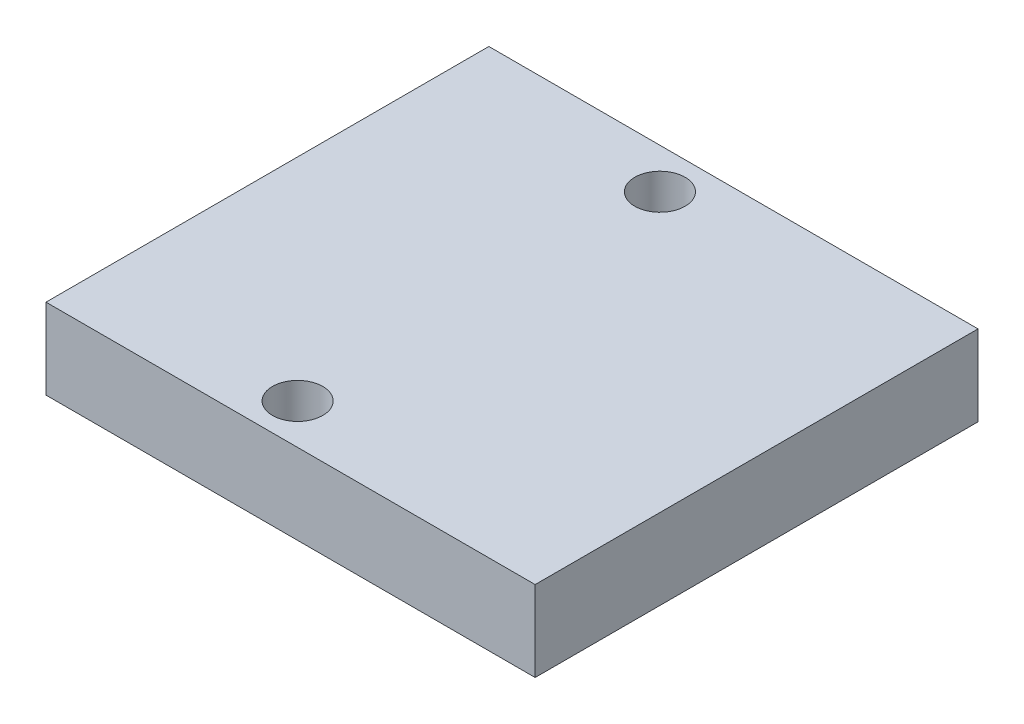
ISO-10303-21;
HEADER;
FILE_DESCRIPTION(('STEP AP214'),'2;1');
FILE_NAME('part.step','',(''),(''),'','','');
FILE_SCHEMA(('AUTOMOTIVE_DESIGN { 1 0 10303 214 1 1 1 1 }'));
ENDSEC;
DATA;
#1=APPLICATION_CONTEXT('core data for automotive mechanical design processes');
#2=APPLICATION_PROTOCOL_DEFINITION('international standard','automotive_design',2000,#1);
#3=PRODUCT_CONTEXT('',#1,'mechanical');
#4=PRODUCT('Part','Part','',(#3));
#5=PRODUCT_RELATED_PRODUCT_CATEGORY('part','',(#4));
#6=PRODUCT_DEFINITION_FORMATION('','',#4);
#7=PRODUCT_DEFINITION_CONTEXT('part definition',#1,'design');
#8=PRODUCT_DEFINITION('design','',#6,#7);
#9=PRODUCT_DEFINITION_SHAPE('','',#8);
#10=(LENGTH_UNIT() NAMED_UNIT(*) SI_UNIT(.MILLI.,.METRE.));
#11=(NAMED_UNIT(*) PLANE_ANGLE_UNIT() SI_UNIT($,.RADIAN.));
#12=(NAMED_UNIT(*) SI_UNIT($,.STERADIAN.) SOLID_ANGLE_UNIT());
#13=UNCERTAINTY_MEASURE_WITH_UNIT(LENGTH_MEASURE(1.E-05),#10,'distance_accuracy_value','');
#14=(GEOMETRIC_REPRESENTATION_CONTEXT(3) GLOBAL_UNCERTAINTY_ASSIGNED_CONTEXT((#13)) GLOBAL_UNIT_ASSIGNED_CONTEXT((#10,
#11,#12)) REPRESENTATION_CONTEXT('',''));
#15=CARTESIAN_POINT('',(0.,0.,0.));
#16=DIRECTION('',(0.,0.,1.));
#17=DIRECTION('',(1.,0.,0.));
#18=AXIS2_PLACEMENT_3D('',#15,#16,#17);
#19=CARTESIAN_POINT('',(0.,4.,0.));
#20=DIRECTION('',(0.,1.,0.));
#21=DIRECTION('',(0.,0.,1.));
#22=AXIS2_PLACEMENT_3D('',#19,#20,#21);
#23=PLANE('',#22);
#24=CARTESIAN_POINT('',(-1.64999999999998,4.,-9.));
#25=DIRECTION('',(0.,1.,0.));
#26=DIRECTION('',(0.,0.,1.));
#27=AXIS2_PLACEMENT_3D('',#24,#25,#26);
#28=CIRCLE('',#27,1.25);
#29=CARTESIAN_POINT('',(-1.64999999999998,4.,-7.75));
#30=VERTEX_POINT('',#29);
#31=EDGE_CURVE('E102',#30,#30,#28,.T.);
#32=ORIENTED_EDGE('',*,*,#31,.F.);
#33=EDGE_LOOP('',(#32));
#34=FACE_BOUND('',#33,.T.);
#35=DIRECTION('',(0.,0.,-1.));
#36=VECTOR('',#35,1.);
#37=CARTESIAN_POINT('',(12.15,4.,-11.));
#38=LINE('',#37,#36);
#39=CARTESIAN_POINT('',(12.15,4.,11.));
#40=VERTEX_POINT('',#39);
#41=CARTESIAN_POINT('',(12.15,4.,-11.));
#42=VERTEX_POINT('',#41);
#43=EDGE_CURVE('E87',#40,#42,#38,.T.);
#44=ORIENTED_EDGE('',*,*,#43,.T.);
#45=DIRECTION('',(-1.,0.,0.));
#46=VECTOR('',#45,1.);
#47=CARTESIAN_POINT('',(-12.15,4.,-11.));
#48=LINE('',#47,#46);
#49=CARTESIAN_POINT('',(-12.15,4.,-11.));
#50=VERTEX_POINT('',#49);
#51=EDGE_CURVE('E82',#42,#50,#48,.T.);
#52=ORIENTED_EDGE('',*,*,#51,.T.);
#53=DIRECTION('',(0.,0.,1.));
#54=VECTOR('',#53,1.);
#55=CARTESIAN_POINT('',(-12.15,4.,-11.));
#56=LINE('',#55,#54);
#57=CARTESIAN_POINT('',(-12.15,4.,11.));
#58=VERTEX_POINT('',#57);
#59=EDGE_CURVE('E85',#50,#58,#56,.T.);
#60=ORIENTED_EDGE('',*,*,#59,.T.);
#61=DIRECTION('',(1.,0.,0.));
#62=VECTOR('',#61,1.);
#63=CARTESIAN_POINT('',(-12.15,4.,11.));
#64=LINE('',#63,#62);
#65=EDGE_CURVE('E52',#58,#40,#64,.T.);
#66=ORIENTED_EDGE('',*,*,#65,.T.);
#67=EDGE_LOOP('',(#44,#52,#60,#66));
#68=FACE_BOUND('',#67,.T.);
#69=CARTESIAN_POINT('',(-1.64999999999998,4.,9.));
#70=DIRECTION('',(0.,1.,0.));
#71=DIRECTION('',(0.,0.,-1.));
#72=AXIS2_PLACEMENT_3D('',#69,#70,#71);
#73=CIRCLE('',#72,1.25);
#74=CARTESIAN_POINT('',(-1.64999999999998,4.,7.75));
#75=VERTEX_POINT('',#74);
#76=EDGE_CURVE('E117',#75,#75,#73,.T.);
#77=ORIENTED_EDGE('',*,*,#76,.F.);
#78=EDGE_LOOP('',(#77));
#79=FACE_BOUND('',#78,.T.);
#80=ADVANCED_FACE('F35',(#34,#68,#79),#23,.T.);
#81=CARTESIAN_POINT('',(0.,0.,0.));
#82=DIRECTION('',(0.,1.,0.));
#83=DIRECTION('',(0.,0.,1.));
#84=AXIS2_PLACEMENT_3D('',#81,#82,#83);
#85=PLANE('',#84);
#86=CARTESIAN_POINT('',(-1.64999999999998,0.,-9.));
#87=DIRECTION('',(0.,1.,0.));
#88=DIRECTION('',(0.,0.,1.));
#89=AXIS2_PLACEMENT_3D('',#86,#87,#88);
#90=CIRCLE('',#89,1.25);
#91=CARTESIAN_POINT('',(-1.64999999999998,0.,-7.75));
#92=VERTEX_POINT('',#91);
#93=EDGE_CURVE('E114',#92,#92,#90,.T.);
#94=ORIENTED_EDGE('',*,*,#93,.T.);
#95=EDGE_LOOP('',(#94));
#96=FACE_BOUND('',#95,.T.);
#97=DIRECTION('',(0.,0.,-1.));
#98=VECTOR('',#97,1.);
#99=CARTESIAN_POINT('',(12.15,0.,-11.));
#100=LINE('',#99,#98);
#101=CARTESIAN_POINT('',(12.15,0.,11.));
#102=VERTEX_POINT('',#101);
#103=CARTESIAN_POINT('',(12.15,0.,-11.));
#104=VERTEX_POINT('',#103);
#105=EDGE_CURVE('E99',#102,#104,#100,.T.);
#106=ORIENTED_EDGE('',*,*,#105,.F.);
#107=DIRECTION('',(1.,0.,0.));
#108=VECTOR('',#107,1.);
#109=CARTESIAN_POINT('',(-12.15,0.,11.));
#110=LINE('',#109,#108);
#111=CARTESIAN_POINT('',(-12.15,0.,11.));
#112=VERTEX_POINT('',#111);
#113=EDGE_CURVE('E75',#112,#102,#110,.T.);
#114=ORIENTED_EDGE('',*,*,#113,.F.);
#115=DIRECTION('',(0.,0.,1.));
#116=VECTOR('',#115,1.);
#117=CARTESIAN_POINT('',(-12.15,0.,-11.));
#118=LINE('',#117,#116);
#119=CARTESIAN_POINT('',(-12.15,0.,-11.));
#120=VERTEX_POINT('',#119);
#121=EDGE_CURVE('E69',#120,#112,#118,.T.);
#122=ORIENTED_EDGE('',*,*,#121,.F.);
#123=DIRECTION('',(-1.,0.,0.));
#124=VECTOR('',#123,1.);
#125=CARTESIAN_POINT('',(-12.15,0.,-11.));
#126=LINE('',#125,#124);
#127=EDGE_CURVE('E91',#104,#120,#126,.T.);
#128=ORIENTED_EDGE('',*,*,#127,.F.);
#129=EDGE_LOOP('',(#106,#114,#122,#128));
#130=FACE_BOUND('',#129,.T.);
#131=CARTESIAN_POINT('',(-1.64999999999998,0.,9.));
#132=DIRECTION('',(0.,1.,0.));
#133=DIRECTION('',(0.,0.,-1.));
#134=AXIS2_PLACEMENT_3D('',#131,#132,#133);
#135=CIRCLE('',#134,1.25);
#136=CARTESIAN_POINT('',(-1.64999999999998,0.,7.75));
#137=VERTEX_POINT('',#136);
#138=EDGE_CURVE('E120',#137,#137,#135,.T.);
#139=ORIENTED_EDGE('',*,*,#138,.T.);
#140=EDGE_LOOP('',(#139));
#141=FACE_BOUND('',#140,.T.);
#142=ADVANCED_FACE('F110',(#96,#130,#141),#85,.F.);
#143=CARTESIAN_POINT('',(12.15,4.,-11.));
#144=DIRECTION('',(-1.,0.,0.));
#145=DIRECTION('',(0.,0.,1.));
#146=AXIS2_PLACEMENT_3D('',#143,#144,#145);
#147=PLANE('',#146);
#148=ORIENTED_EDGE('',*,*,#105,.T.);
#149=DIRECTION('',(0.,-1.,0.));
#150=VECTOR('',#149,1.);
#151=CARTESIAN_POINT('',(12.15,4.,-11.));
#152=LINE('',#151,#150);
#153=EDGE_CURVE('E11',#42,#104,#152,.T.);
#154=ORIENTED_EDGE('',*,*,#153,.F.);
#155=ORIENTED_EDGE('',*,*,#43,.F.);
#156=DIRECTION('',(0.,-1.,0.));
#157=VECTOR('',#156,1.);
#158=CARTESIAN_POINT('',(12.15,4.,11.));
#159=LINE('',#158,#157);
#160=EDGE_CURVE('E95',#40,#102,#159,.T.);
#161=ORIENTED_EDGE('',*,*,#160,.T.);
#162=EDGE_LOOP('',(#148,#154,#155,#161));
#163=FACE_BOUND('',#162,.T.);
#164=ADVANCED_FACE('F37',(#163),#147,.F.);
#165=CARTESIAN_POINT('',(-12.15,4.,-11.));
#166=DIRECTION('',(0.,0.,1.));
#167=DIRECTION('',(1.,0.,0.));
#168=AXIS2_PLACEMENT_3D('',#165,#166,#167);
#169=PLANE('',#168);
#170=ORIENTED_EDGE('',*,*,#127,.T.);
#171=DIRECTION('',(0.,-1.,0.));
#172=VECTOR('',#171,1.);
#173=CARTESIAN_POINT('',(-12.15,4.,-11.));
#174=LINE('',#173,#172);
#175=EDGE_CURVE('E44',#50,#120,#174,.T.);
#176=ORIENTED_EDGE('',*,*,#175,.F.);
#177=ORIENTED_EDGE('',*,*,#51,.F.);
#178=ORIENTED_EDGE('',*,*,#153,.T.);
#179=EDGE_LOOP('',(#170,#176,#177,#178));
#180=FACE_BOUND('',#179,.T.);
#181=ADVANCED_FACE('F90',(#180),#169,.F.);
#182=CARTESIAN_POINT('',(-12.15,4.,-11.));
#183=DIRECTION('',(1.,0.,0.));
#184=DIRECTION('',(0.,0.,-1.));
#185=AXIS2_PLACEMENT_3D('',#182,#183,#184);
#186=PLANE('',#185);
#187=ORIENTED_EDGE('',*,*,#121,.T.);
#188=DIRECTION('',(0.,-1.,0.));
#189=VECTOR('',#188,1.);
#190=CARTESIAN_POINT('',(-12.15,4.,11.));
#191=LINE('',#190,#189);
#192=EDGE_CURVE('E92',#58,#112,#191,.T.);
#193=ORIENTED_EDGE('',*,*,#192,.F.);
#194=ORIENTED_EDGE('',*,*,#59,.F.);
#195=ORIENTED_EDGE('',*,*,#175,.T.);
#196=EDGE_LOOP('',(#187,#193,#194,#195));
#197=FACE_BOUND('',#196,.T.);
#198=ADVANCED_FACE('F93',(#197),#186,.F.);
#199=CARTESIAN_POINT('',(-12.15,4.,11.));
#200=DIRECTION('',(0.,0.,-1.));
#201=DIRECTION('',(-1.,0.,0.));
#202=AXIS2_PLACEMENT_3D('',#199,#200,#201);
#203=PLANE('',#202);
#204=ORIENTED_EDGE('',*,*,#113,.T.);
#205=ORIENTED_EDGE('',*,*,#160,.F.);
#206=ORIENTED_EDGE('',*,*,#65,.F.);
#207=ORIENTED_EDGE('',*,*,#192,.T.);
#208=EDGE_LOOP('',(#204,#205,#206,#207));
#209=FACE_BOUND('',#208,.T.);
#210=ADVANCED_FACE('F107',(#209),#203,.F.);
#211=CARTESIAN_POINT('',(-1.64999999999998,4.,-9.));
#212=DIRECTION('',(0.,-1.,0.));
#213=DIRECTION('',(0.,0.,-1.));
#214=AXIS2_PLACEMENT_3D('',#211,#212,#213);
#215=CYLINDRICAL_SURFACE('',#214,1.25);
#216=ORIENTED_EDGE('',*,*,#31,.T.);
#217=EDGE_LOOP('',(#216));
#218=FACE_BOUND('',#217,.T.);
#219=ORIENTED_EDGE('',*,*,#93,.F.);
#220=EDGE_LOOP('',(#219));
#221=FACE_BOUND('',#220,.T.);
#222=ADVANCED_FACE('F138',(#218,#221),#215,.F.);
#223=CARTESIAN_POINT('',(-1.64999999999998,4.,9.));
#224=DIRECTION('',(0.,-1.,0.));
#225=DIRECTION('',(0.,0.,-1.));
#226=AXIS2_PLACEMENT_3D('',#223,#224,#225);
#227=CYLINDRICAL_SURFACE('',#226,1.25);
#228=ORIENTED_EDGE('',*,*,#76,.T.);
#229=EDGE_LOOP('',(#228));
#230=FACE_BOUND('',#229,.T.);
#231=ORIENTED_EDGE('',*,*,#138,.F.);
#232=EDGE_LOOP('',(#231));
#233=FACE_BOUND('',#232,.T.);
#234=ADVANCED_FACE('F126',(#230,#233),#227,.F.);
#235=CLOSED_SHELL('',(#80,#142,#164,#181,#198,#210,#222,#234));
#236=MANIFOLD_SOLID_BREP('B2',#235);
#237=ADVANCED_BREP_SHAPE_REPRESENTATION('',(#18,#236),#14);
#238=SHAPE_DEFINITION_REPRESENTATION(#9,#237);
ENDSEC;
END-ISO-10303-21;
